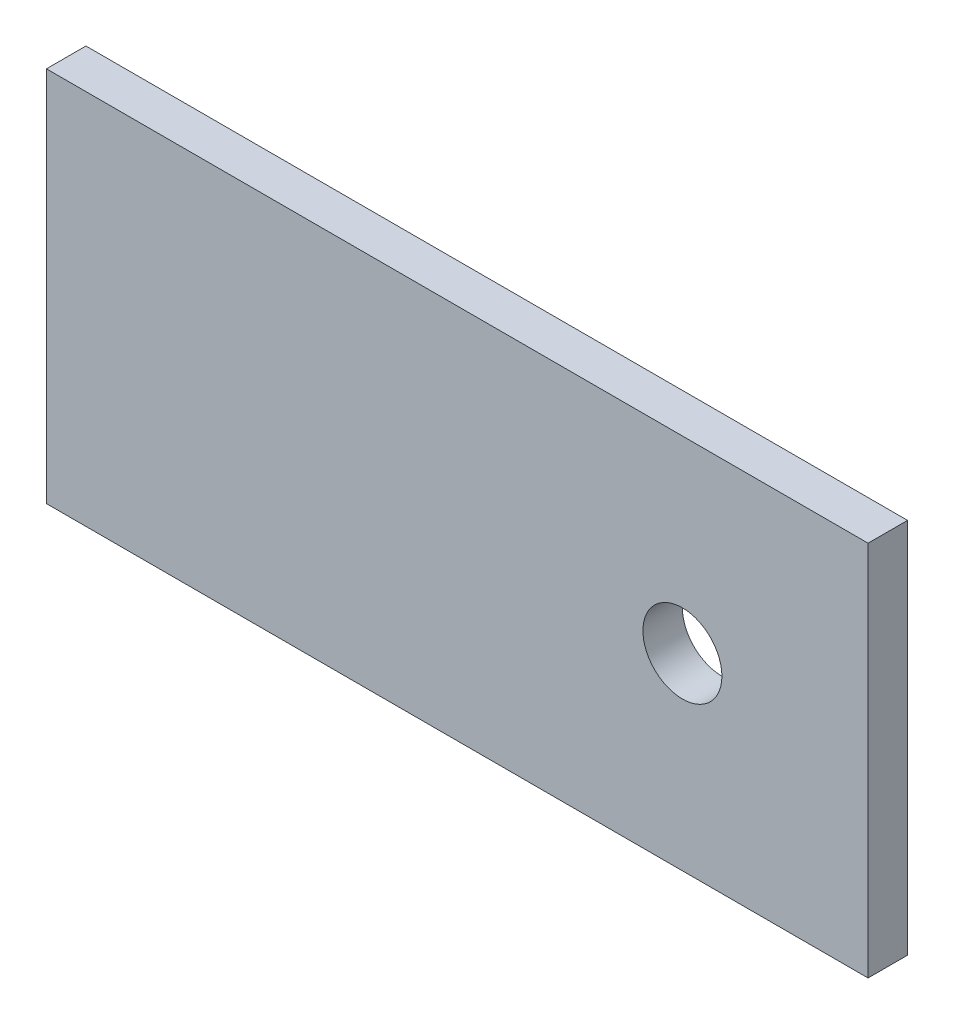
ISO-10303-21;
HEADER;
FILE_DESCRIPTION(('STEP AP214'),'2;1');
FILE_NAME('part.step','',(''),(''),'','','');
FILE_SCHEMA(('AUTOMOTIVE_DESIGN { 1 0 10303 214 1 1 1 1 }'));
ENDSEC;
DATA;
#1=APPLICATION_CONTEXT('core data for automotive mechanical design processes');
#2=APPLICATION_PROTOCOL_DEFINITION('international standard','automotive_design',2000,#1);
#3=PRODUCT_CONTEXT('',#1,'mechanical');
#4=PRODUCT('Part','Part','',(#3));
#5=PRODUCT_RELATED_PRODUCT_CATEGORY('part','',(#4));
#6=PRODUCT_DEFINITION_FORMATION('','',#4);
#7=PRODUCT_DEFINITION_CONTEXT('part definition',#1,'design');
#8=PRODUCT_DEFINITION('design','',#6,#7);
#9=PRODUCT_DEFINITION_SHAPE('','',#8);
#10=(LENGTH_UNIT() NAMED_UNIT(*) SI_UNIT(.MILLI.,.METRE.));
#11=(NAMED_UNIT(*) PLANE_ANGLE_UNIT() SI_UNIT($,.RADIAN.));
#12=(NAMED_UNIT(*) SI_UNIT($,.STERADIAN.) SOLID_ANGLE_UNIT());
#13=UNCERTAINTY_MEASURE_WITH_UNIT(LENGTH_MEASURE(1.E-05),#10,'distance_accuracy_value','');
#14=(GEOMETRIC_REPRESENTATION_CONTEXT(3) GLOBAL_UNCERTAINTY_ASSIGNED_CONTEXT((#13)) GLOBAL_UNIT_ASSIGNED_CONTEXT((#10,
#11,#12)) REPRESENTATION_CONTEXT('',''));
#15=CARTESIAN_POINT('',(0.,0.,0.));
#16=DIRECTION('',(0.,0.,1.));
#17=DIRECTION('',(1.,0.,0.));
#18=AXIS2_PLACEMENT_3D('',#15,#16,#17);
#19=CARTESIAN_POINT('',(15.61,-7.15,0.01));
#20=DIRECTION('',(0.,-1.,0.));
#21=DIRECTION('',(-1.,0.,0.));
#22=AXIS2_PLACEMENT_3D('',#19,#20,#21);
#23=PLANE('',#22);
#24=DIRECTION('',(-1.,0.,0.));
#25=VECTOR('',#24,1.);
#26=CARTESIAN_POINT('',(0.,-7.15,-1.5));
#27=LINE('',#26,#25);
#28=CARTESIAN_POINT('',(15.6,-7.15,-1.5));
#29=VERTEX_POINT('',#28);
#30=CARTESIAN_POINT('',(-15.6,-7.15,-1.5));
#31=VERTEX_POINT('',#30);
#32=EDGE_CURVE('E54',#29,#31,#27,.T.);
#33=ORIENTED_EDGE('',*,*,#32,.F.);
#34=DIRECTION('',(0.,0.,-1.));
#35=VECTOR('',#34,1.);
#36=CARTESIAN_POINT('',(15.6,-7.15,-0.75));
#37=LINE('',#36,#35);
#38=CARTESIAN_POINT('',(15.6,-7.15,0.));
#39=VERTEX_POINT('',#38);
#40=EDGE_CURVE('E81',#39,#29,#37,.T.);
#41=ORIENTED_EDGE('',*,*,#40,.F.);
#42=DIRECTION('',(1.,0.,0.));
#43=VECTOR('',#42,1.);
#44=CARTESIAN_POINT('',(0.,-7.15,0.));
#45=LINE('',#44,#43);
#46=CARTESIAN_POINT('',(-15.6,-7.15,0.));
#47=VERTEX_POINT('',#46);
#48=EDGE_CURVE('E60',#47,#39,#45,.T.);
#49=ORIENTED_EDGE('',*,*,#48,.F.);
#50=DIRECTION('',(0.,0.,1.));
#51=VECTOR('',#50,1.);
#52=CARTESIAN_POINT('',(-15.6,-7.15,-0.75));
#53=LINE('',#52,#51);
#54=EDGE_CURVE('E57',#31,#47,#53,.T.);
#55=ORIENTED_EDGE('',*,*,#54,.F.);
#56=EDGE_LOOP('',(#33,#41,#49,#55));
#57=FACE_BOUND('',#56,.T.);
#58=ADVANCED_FACE('F17',(#57),#23,.T.);
#59=CARTESIAN_POINT('',(15.6,7.16,0.01));
#60=DIRECTION('',(1.,0.,0.));
#61=DIRECTION('',(0.,-1.,0.));
#62=AXIS2_PLACEMENT_3D('',#59,#60,#61);
#63=PLANE('',#62);
#64=DIRECTION('',(0.,-1.,0.));
#65=VECTOR('',#64,1.);
#66=CARTESIAN_POINT('',(15.6,0.,-1.5));
#67=LINE('',#66,#65);
#68=CARTESIAN_POINT('',(15.6,7.15,-1.5));
#69=VERTEX_POINT('',#68);
#70=EDGE_CURVE('E74',#69,#29,#67,.T.);
#71=ORIENTED_EDGE('',*,*,#70,.F.);
#72=DIRECTION('',(0.,0.,-1.));
#73=VECTOR('',#72,1.);
#74=CARTESIAN_POINT('',(15.6,7.15,-0.75));
#75=LINE('',#74,#73);
#76=CARTESIAN_POINT('',(15.6,7.15,0.));
#77=VERTEX_POINT('',#76);
#78=EDGE_CURVE('E79',#77,#69,#75,.T.);
#79=ORIENTED_EDGE('',*,*,#78,.F.);
#80=DIRECTION('',(0.,1.,0.));
#81=VECTOR('',#80,1.);
#82=CARTESIAN_POINT('',(15.6,0.,0.));
#83=LINE('',#82,#81);
#84=EDGE_CURVE('E86',#39,#77,#83,.T.);
#85=ORIENTED_EDGE('',*,*,#84,.F.);
#86=ORIENTED_EDGE('',*,*,#40,.T.);
#87=EDGE_LOOP('',(#71,#79,#85,#86));
#88=FACE_BOUND('',#87,.T.);
#89=ADVANCED_FACE('F84',(#88),#63,.T.);
#90=CARTESIAN_POINT('',(-15.61,7.15,0.01));
#91=DIRECTION('',(0.,1.,0.));
#92=DIRECTION('',(1.,0.,0.));
#93=AXIS2_PLACEMENT_3D('',#90,#91,#92);
#94=PLANE('',#93);
#95=DIRECTION('',(1.,0.,0.));
#96=VECTOR('',#95,1.);
#97=CARTESIAN_POINT('',(0.,7.15,-1.5));
#98=LINE('',#97,#96);
#99=CARTESIAN_POINT('',(-15.6,7.15,-1.5));
#100=VERTEX_POINT('',#99);
#101=EDGE_CURVE('E69',#100,#69,#98,.T.);
#102=ORIENTED_EDGE('',*,*,#101,.F.);
#103=DIRECTION('',(0.,0.,-1.));
#104=VECTOR('',#103,1.);
#105=CARTESIAN_POINT('',(-15.6,7.15,-0.75));
#106=LINE('',#105,#104);
#107=CARTESIAN_POINT('',(-15.6,7.15,0.));
#108=VERTEX_POINT('',#107);
#109=EDGE_CURVE('E34',#108,#100,#106,.T.);
#110=ORIENTED_EDGE('',*,*,#109,.F.);
#111=DIRECTION('',(-1.,0.,0.));
#112=VECTOR('',#111,1.);
#113=CARTESIAN_POINT('',(0.,7.15,0.));
#114=LINE('',#113,#112);
#115=EDGE_CURVE('E89',#77,#108,#114,.T.);
#116=ORIENTED_EDGE('',*,*,#115,.F.);
#117=ORIENTED_EDGE('',*,*,#78,.T.);
#118=EDGE_LOOP('',(#102,#110,#116,#117));
#119=FACE_BOUND('',#118,.T.);
#120=ADVANCED_FACE('F96',(#119),#94,.T.);
#121=CARTESIAN_POINT('',(-15.6,-7.16,0.01));
#122=DIRECTION('',(-1.,0.,0.));
#123=DIRECTION('',(0.,1.,0.));
#124=AXIS2_PLACEMENT_3D('',#121,#122,#123);
#125=PLANE('',#124);
#126=DIRECTION('',(0.,1.,0.));
#127=VECTOR('',#126,1.);
#128=CARTESIAN_POINT('',(-15.6,0.,-1.5));
#129=LINE('',#128,#127);
#130=EDGE_CURVE('E65',#31,#100,#129,.T.);
#131=ORIENTED_EDGE('',*,*,#130,.F.);
#132=ORIENTED_EDGE('',*,*,#54,.T.);
#133=DIRECTION('',(0.,-1.,0.));
#134=VECTOR('',#133,1.);
#135=CARTESIAN_POINT('',(-15.6,0.,0.));
#136=LINE('',#135,#134);
#137=EDGE_CURVE('E92',#108,#47,#136,.T.);
#138=ORIENTED_EDGE('',*,*,#137,.F.);
#139=ORIENTED_EDGE('',*,*,#109,.T.);
#140=EDGE_LOOP('',(#131,#132,#138,#139));
#141=FACE_BOUND('',#140,.T.);
#142=ADVANCED_FACE('F66',(#141),#125,.T.);
#143=CARTESIAN_POINT('',(15.61,-7.16,-1.5));
#144=DIRECTION('',(0.,0.,-1.));
#145=DIRECTION('',(-1.,0.,0.));
#146=AXIS2_PLACEMENT_3D('',#143,#144,#145);
#147=PLANE('',#146);
#148=CARTESIAN_POINT('',(8.55,0.,-1.5));
#149=DIRECTION('',(0.,0.,-1.));
#150=DIRECTION('',(-1.,0.,0.));
#151=AXIS2_PLACEMENT_3D('',#148,#149,#150);
#152=CIRCLE('',#151,1.5);
#153=CARTESIAN_POINT('',(7.05,0.,-1.5));
#154=VERTEX_POINT('',#153);
#155=EDGE_CURVE('E21',#154,#154,#152,.T.);
#156=ORIENTED_EDGE('',*,*,#155,.F.);
#157=EDGE_LOOP('',(#156));
#158=FACE_BOUND('',#157,.T.);
#159=ORIENTED_EDGE('',*,*,#101,.T.);
#160=ORIENTED_EDGE('',*,*,#70,.T.);
#161=ORIENTED_EDGE('',*,*,#32,.T.);
#162=ORIENTED_EDGE('',*,*,#130,.T.);
#163=EDGE_LOOP('',(#159,#160,#161,#162));
#164=FACE_BOUND('',#163,.T.);
#165=ADVANCED_FACE('F72',(#158,#164),#147,.T.);
#166=CARTESIAN_POINT('',(-15.61,-7.16,0.));
#167=DIRECTION('',(0.,0.,1.));
#168=DIRECTION('',(1.,0.,0.));
#169=AXIS2_PLACEMENT_3D('',#166,#167,#168);
#170=PLANE('',#169);
#171=CARTESIAN_POINT('',(8.55,0.,0.));
#172=DIRECTION('',(0.,0.,1.));
#173=DIRECTION('',(1.,0.,0.));
#174=AXIS2_PLACEMENT_3D('',#171,#172,#173);
#175=CIRCLE('',#174,1.5);
#176=CARTESIAN_POINT('',(10.05,0.,0.));
#177=VERTEX_POINT('',#176);
#178=EDGE_CURVE('E11',#177,#177,#175,.T.);
#179=ORIENTED_EDGE('',*,*,#178,.F.);
#180=EDGE_LOOP('',(#179));
#181=FACE_BOUND('',#180,.T.);
#182=ORIENTED_EDGE('',*,*,#115,.T.);
#183=ORIENTED_EDGE('',*,*,#137,.T.);
#184=ORIENTED_EDGE('',*,*,#48,.T.);
#185=ORIENTED_EDGE('',*,*,#84,.T.);
#186=EDGE_LOOP('',(#182,#183,#184,#185));
#187=FACE_BOUND('',#186,.T.);
#188=ADVANCED_FACE('F91',(#181,#187),#170,.T.);
#189=CARTESIAN_POINT('',(8.55,0.,-1.5));
#190=DIRECTION('',(0.,0.,1.));
#191=DIRECTION('',(1.,0.,0.));
#192=AXIS2_PLACEMENT_3D('',#189,#190,#191);
#193=CYLINDRICAL_SURFACE('',#192,1.5);
#194=ORIENTED_EDGE('',*,*,#178,.T.);
#195=EDGE_LOOP('',(#194));
#196=FACE_BOUND('',#195,.T.);
#197=ORIENTED_EDGE('',*,*,#155,.T.);
#198=EDGE_LOOP('',(#197));
#199=FACE_BOUND('',#198,.T.);
#200=ADVANCED_FACE('F19',(#196,#199),#193,.F.);
#201=CLOSED_SHELL('',(#58,#89,#120,#142,#165,#188,#200));
#202=MANIFOLD_SOLID_BREP('B1',#201);
#203=ADVANCED_BREP_SHAPE_REPRESENTATION('',(#18,#202),#14);
#204=SHAPE_DEFINITION_REPRESENTATION(#9,#203);
ENDSEC;
END-ISO-10303-21;
